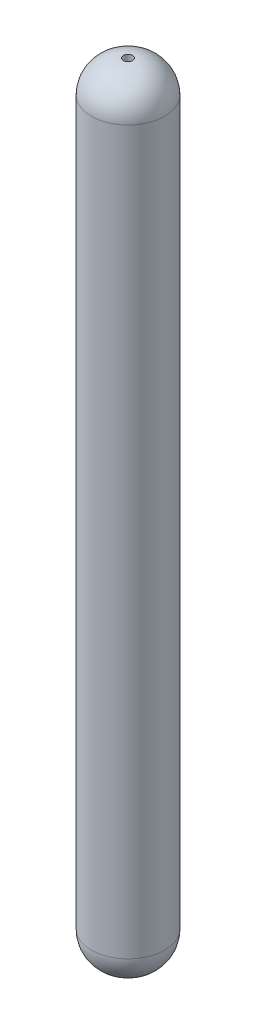
ISO-10303-21;
HEADER;
FILE_DESCRIPTION(('STEP AP214'),'2;1');
FILE_NAME('part.step','',(''),(''),'','','');
FILE_SCHEMA(('AUTOMOTIVE_DESIGN { 1 0 10303 214 1 1 1 1 }'));
ENDSEC;
DATA;
#1=APPLICATION_CONTEXT('core data for automotive mechanical design processes');
#2=APPLICATION_PROTOCOL_DEFINITION('international standard','automotive_design',2000,#1);
#3=PRODUCT_CONTEXT('',#1,'mechanical');
#4=PRODUCT('Part','Part','',(#3));
#5=PRODUCT_RELATED_PRODUCT_CATEGORY('part','',(#4));
#6=PRODUCT_DEFINITION_FORMATION('','',#4);
#7=PRODUCT_DEFINITION_CONTEXT('part definition',#1,'design');
#8=PRODUCT_DEFINITION('design','',#6,#7);
#9=PRODUCT_DEFINITION_SHAPE('','',#8);
#10=(LENGTH_UNIT() NAMED_UNIT(*) SI_UNIT(.MILLI.,.METRE.));
#11=(NAMED_UNIT(*) PLANE_ANGLE_UNIT() SI_UNIT($,.RADIAN.));
#12=(NAMED_UNIT(*) SI_UNIT($,.STERADIAN.) SOLID_ANGLE_UNIT());
#13=UNCERTAINTY_MEASURE_WITH_UNIT(LENGTH_MEASURE(1.E-05),#10,'distance_accuracy_value','');
#14=(GEOMETRIC_REPRESENTATION_CONTEXT(3) GLOBAL_UNCERTAINTY_ASSIGNED_CONTEXT((#13)) GLOBAL_UNIT_ASSIGNED_CONTEXT((#10,
#11,#12)) REPRESENTATION_CONTEXT('',''));
#15=CARTESIAN_POINT('',(0.,0.,0.));
#16=DIRECTION('',(0.,0.,1.));
#17=DIRECTION('',(1.,0.,0.));
#18=AXIS2_PLACEMENT_3D('',#15,#16,#17);
#19=CARTESIAN_POINT('',(0.,-500.,0.));
#20=DIRECTION('',(0.,-1.,0.));
#21=DIRECTION('',(0.,0.,-1.));
#22=AXIS2_PLACEMENT_3D('',#19,#20,#21);
#23=DEGENERATE_TOROIDAL_SURFACE('',#22,6.34999999999999,44.4500000000001,.T.);
#24=CARTESIAN_POINT('',(0.,-500.,0.));
#25=DIRECTION('',(0.,-1.,0.));
#26=DIRECTION('',(0.,0.,-1.));
#27=AXIS2_PLACEMENT_3D('',#24,#25,#26);
#28=CIRCLE('',#27,50.8000000000001);
#29=CARTESIAN_POINT('',(0.,-500.,-50.8000000000001));
#30=VERTEX_POINT('',#29);
#31=EDGE_CURVE('E45',#30,#30,#28,.T.);
#32=ORIENTED_EDGE('',*,*,#31,.T.);
#33=EDGE_LOOP('',(#32));
#34=FACE_BOUND('',#33,.T.);
#35=CARTESIAN_POINT('',(0.,-544.45,0.));
#36=DIRECTION('',(0.,-1.,0.));
#37=DIRECTION('',(0.,0.,-1.));
#38=AXIS2_PLACEMENT_3D('',#35,#36,#37);
#39=CIRCLE('',#38,6.35);
#40=CARTESIAN_POINT('',(0.,-544.45,-6.35));
#41=VERTEX_POINT('',#40);
#42=EDGE_CURVE('E10',#41,#41,#39,.T.);
#43=ORIENTED_EDGE('',*,*,#42,.F.);
#44=EDGE_LOOP('',(#43));
#45=FACE_BOUND('',#44,.T.);
#46=ADVANCED_FACE('F31',(#34,#45),#23,.T.);
#47=CARTESIAN_POINT('',(0.,-7.11525336956728,0.));
#48=DIRECTION('',(0.,-1.,0.));
#49=DIRECTION('',(0.,0.,-1.));
#50=AXIS2_PLACEMENT_3D('',#47,#48,#49);
#51=CYLINDRICAL_SURFACE('',#50,6.35);
#52=ORIENTED_EDGE('',*,*,#42,.T.);
#53=EDGE_LOOP('',(#52));
#54=FACE_BOUND('',#53,.T.);
#55=CARTESIAN_POINT('',(0.,544.45,0.));
#56=DIRECTION('',(0.,-1.,0.));
#57=DIRECTION('',(0.,0.,-1.));
#58=AXIS2_PLACEMENT_3D('',#55,#56,#57);
#59=CIRCLE('',#58,6.35);
#60=CARTESIAN_POINT('',(0.,544.45,-6.35));
#61=VERTEX_POINT('',#60);
#62=EDGE_CURVE('E37',#61,#61,#59,.T.);
#63=ORIENTED_EDGE('',*,*,#62,.F.);
#64=EDGE_LOOP('',(#63));
#65=FACE_BOUND('',#64,.T.);
#66=ADVANCED_FACE('F61',(#54,#65),#51,.F.);
#67=CARTESIAN_POINT('',(0.,500.,0.));
#68=DIRECTION('',(0.,-1.,0.));
#69=DIRECTION('',(0.,0.,-1.));
#70=AXIS2_PLACEMENT_3D('',#67,#68,#69);
#71=DEGENERATE_TOROIDAL_SURFACE('',#70,6.34999999999999,44.4500000000001,.T.);
#72=ORIENTED_EDGE('',*,*,#62,.T.);
#73=EDGE_LOOP('',(#72));
#74=FACE_BOUND('',#73,.T.);
#75=CARTESIAN_POINT('',(0.,500.,0.));
#76=DIRECTION('',(0.,-1.,0.));
#77=DIRECTION('',(0.,0.,-1.));
#78=AXIS2_PLACEMENT_3D('',#75,#76,#77);
#79=CIRCLE('',#78,50.8000000000001);
#80=CARTESIAN_POINT('',(0.,500.,-50.8000000000001));
#81=VERTEX_POINT('',#80);
#82=EDGE_CURVE('E41',#81,#81,#79,.T.);
#83=ORIENTED_EDGE('',*,*,#82,.F.);
#84=EDGE_LOOP('',(#83));
#85=FACE_BOUND('',#84,.T.);
#86=ADVANCED_FACE('F55',(#74,#85),#71,.T.);
#87=CARTESIAN_POINT('',(0.,-7.11525336956728,0.));
#88=DIRECTION('',(0.,-1.,0.));
#89=DIRECTION('',(0.,0.,-1.));
#90=AXIS2_PLACEMENT_3D('',#87,#88,#89);
#91=CYLINDRICAL_SURFACE('',#90,50.8000000000001);
#92=ORIENTED_EDGE('',*,*,#82,.T.);
#93=EDGE_LOOP('',(#92));
#94=FACE_BOUND('',#93,.T.);
#95=ORIENTED_EDGE('',*,*,#31,.F.);
#96=EDGE_LOOP('',(#95));
#97=FACE_BOUND('',#96,.T.);
#98=ADVANCED_FACE('F53',(#94,#97),#91,.T.);
#99=CLOSED_SHELL('',(#46,#66,#86,#98));
#100=MANIFOLD_SOLID_BREP('B2',#99);
#101=ADVANCED_BREP_SHAPE_REPRESENTATION('',(#18,#100),#14);
#102=SHAPE_DEFINITION_REPRESENTATION(#9,#101);
ENDSEC;
END-ISO-10303-21;
